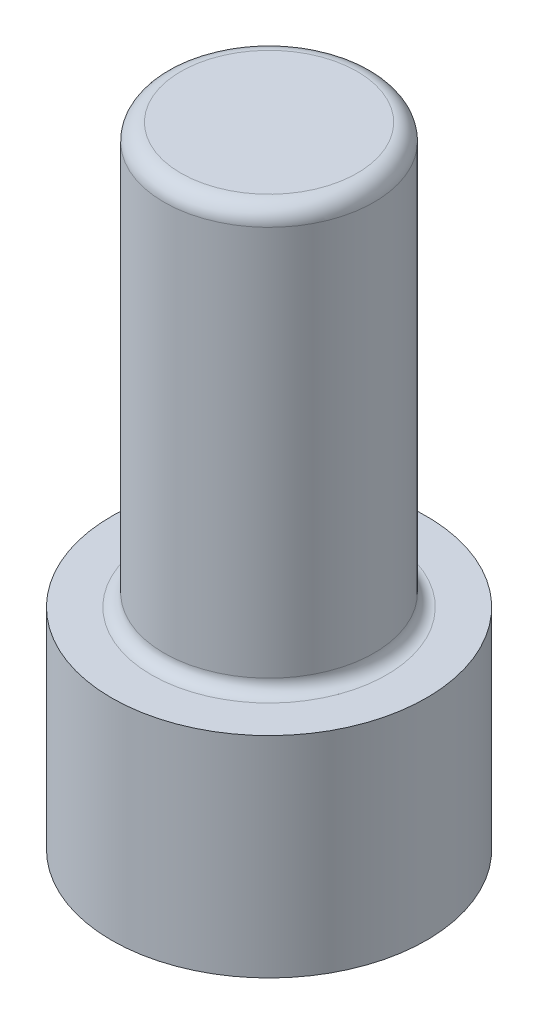
ISO-10303-21;
HEADER;
FILE_DESCRIPTION(('STEP AP214'),'2;1');
FILE_NAME('part.step','',(''),(''),'','','');
FILE_SCHEMA(('AUTOMOTIVE_DESIGN { 1 0 10303 214 1 1 1 1 }'));
ENDSEC;
DATA;
#1=APPLICATION_CONTEXT('core data for automotive mechanical design processes');
#2=APPLICATION_PROTOCOL_DEFINITION('international standard','automotive_design',2000,#1);
#3=PRODUCT_CONTEXT('',#1,'mechanical');
#4=PRODUCT('Part','Part','',(#3));
#5=PRODUCT_RELATED_PRODUCT_CATEGORY('part','',(#4));
#6=PRODUCT_DEFINITION_FORMATION('','',#4);
#7=PRODUCT_DEFINITION_CONTEXT('part definition',#1,'design');
#8=PRODUCT_DEFINITION('design','',#6,#7);
#9=PRODUCT_DEFINITION_SHAPE('','',#8);
#10=(LENGTH_UNIT() NAMED_UNIT(*) SI_UNIT(.MILLI.,.METRE.));
#11=(NAMED_UNIT(*) PLANE_ANGLE_UNIT() SI_UNIT($,.RADIAN.));
#12=(NAMED_UNIT(*) SI_UNIT($,.STERADIAN.) SOLID_ANGLE_UNIT());
#13=UNCERTAINTY_MEASURE_WITH_UNIT(LENGTH_MEASURE(1.E-05),#10,'distance_accuracy_value','');
#14=(GEOMETRIC_REPRESENTATION_CONTEXT(3) GLOBAL_UNCERTAINTY_ASSIGNED_CONTEXT((#13)) GLOBAL_UNIT_ASSIGNED_CONTEXT((#10,
#11,#12)) REPRESENTATION_CONTEXT('',''));
#15=CARTESIAN_POINT('',(0.,0.,0.));
#16=DIRECTION('',(0.,0.,1.));
#17=DIRECTION('',(1.,0.,0.));
#18=AXIS2_PLACEMENT_3D('',#15,#16,#17);
#19=CARTESIAN_POINT('',(0.,250.,0.));
#20=DIRECTION('',(0.,-1.,0.));
#21=DIRECTION('',(0.,0.,-1.));
#22=AXIS2_PLACEMENT_3D('',#19,#20,#21);
#23=CYLINDRICAL_SURFACE('',#22,187.5);
#24=CARTESIAN_POINT('',(0.,250.,0.));
#25=DIRECTION('',(0.,1.,0.));
#26=DIRECTION('',(0.,0.,1.));
#27=AXIS2_PLACEMENT_3D('',#24,#25,#26);
#28=CIRCLE('',#27,187.5);
#29=CARTESIAN_POINT('',(0.,250.,187.5));
#30=VERTEX_POINT('',#29);
#31=EDGE_CURVE('E141',#30,#30,#28,.T.);
#32=ORIENTED_EDGE('',*,*,#31,.F.);
#33=EDGE_LOOP('',(#32));
#34=FACE_BOUND('',#33,.T.);
#35=CARTESIAN_POINT('',(0.,0.,0.));
#36=DIRECTION('',(0.,1.,0.));
#37=DIRECTION('',(0.,0.,1.));
#38=AXIS2_PLACEMENT_3D('',#35,#36,#37);
#39=CIRCLE('',#38,187.5);
#40=CARTESIAN_POINT('',(0.,0.,187.5));
#41=VERTEX_POINT('',#40);
#42=EDGE_CURVE('E135',#41,#41,#39,.T.);
#43=ORIENTED_EDGE('',*,*,#42,.T.);
#44=EDGE_LOOP('',(#43));
#45=FACE_BOUND('',#44,.T.);
#46=ADVANCED_FACE('F33',(#34,#45),#23,.T.);
#47=CARTESIAN_POINT('',(0.,250.,0.));
#48=DIRECTION('',(0.,1.,0.));
#49=DIRECTION('',(0.,0.,1.));
#50=AXIS2_PLACEMENT_3D('',#47,#48,#49);
#51=PLANE('',#50);
#52=CARTESIAN_POINT('',(0.,250.,0.));
#53=DIRECTION('',(0.,1.,0.));
#54=DIRECTION('',(0.,0.,1.));
#55=AXIS2_PLACEMENT_3D('',#52,#53,#54);
#56=CIRCLE('',#55,140.);
#57=CARTESIAN_POINT('',(0.,250.,140.));
#58=VERTEX_POINT('',#57);
#59=EDGE_CURVE('E149',#58,#58,#56,.F.);
#60=ORIENTED_EDGE('',*,*,#59,.T.);
#61=EDGE_LOOP('',(#60));
#62=FACE_BOUND('',#61,.T.);
#63=ORIENTED_EDGE('',*,*,#31,.T.);
#64=EDGE_LOOP('',(#63));
#65=FACE_BOUND('',#64,.T.);
#66=ADVANCED_FACE('F169',(#62,#65),#51,.T.);
#67=CARTESIAN_POINT('',(0.,0.,0.));
#68=DIRECTION('',(0.,1.,0.));
#69=DIRECTION('',(0.,0.,1.));
#70=AXIS2_PLACEMENT_3D('',#67,#68,#69);
#71=PLANE('',#70);
#72=DIRECTION('',(0.207609867923908,0.,-0.978211706503565));
#73=VECTOR('',#72,1.);
#74=CARTESIAN_POINT('',(-97.2142447029592,0.,31.6199889550411));
#75=LINE('',#74,#73);
#76=CARTESIAN_POINT('',(-97.2142447029592,0.,31.6199889550411));
#77=VERTEX_POINT('',#76);
#78=CARTESIAN_POINT('',(-75.9908360539285,0.,-68.380011044959));
#79=VERTEX_POINT('',#78);
#80=EDGE_CURVE('E122',#77,#79,#75,.T.);
#81=ORIENTED_EDGE('',*,*,#80,.F.);
#82=DIRECTION('',(-0.743351254149461,0.,-0.66890127295022));
#83=VECTOR('',#82,1.);
#84=CARTESIAN_POINT('',(-21.2234086490307,0.,100.));
#85=LINE('',#84,#83);
#86=CARTESIAN_POINT('',(-21.2234086490307,0.,100.));
#87=VERTEX_POINT('',#86);
#88=EDGE_CURVE('E48',#87,#77,#85,.T.);
#89=ORIENTED_EDGE('',*,*,#88,.F.);
#90=DIRECTION('',(-0.950961122073369,0.,0.309310433553346));
#91=VECTOR('',#90,1.);
#92=CARTESIAN_POINT('',(75.9908360539285,0.,68.380011044959));
#93=LINE('',#92,#91);
#94=CARTESIAN_POINT('',(75.9908360539285,0.,68.380011044959));
#95=VERTEX_POINT('',#94);
#96=EDGE_CURVE('E131',#95,#87,#93,.T.);
#97=ORIENTED_EDGE('',*,*,#96,.F.);
#98=DIRECTION('',(-0.207609867923908,0.,0.978211706503565));
#99=VECTOR('',#98,1.);
#100=CARTESIAN_POINT('',(97.2142447029592,0.,-31.6199889550411));
#101=LINE('',#100,#99);
#102=CARTESIAN_POINT('',(97.2142447029592,0.,-31.6199889550411));
#103=VERTEX_POINT('',#102);
#104=EDGE_CURVE('E129',#103,#95,#101,.T.);
#105=ORIENTED_EDGE('',*,*,#104,.F.);
#106=DIRECTION('',(0.743351254149461,0.,0.668901272950219));
#107=VECTOR('',#106,1.);
#108=CARTESIAN_POINT('',(21.2234086490307,0.,-100.));
#109=LINE('',#108,#107);
#110=CARTESIAN_POINT('',(21.2234086490307,0.,-100.));
#111=VERTEX_POINT('',#110);
#112=EDGE_CURVE('E96',#111,#103,#109,.T.);
#113=ORIENTED_EDGE('',*,*,#112,.F.);
#114=DIRECTION('',(0.950961122073369,0.,-0.309310433553346));
#115=VECTOR('',#114,1.);
#116=CARTESIAN_POINT('',(-75.9908360539285,0.,-68.380011044959));
#117=LINE('',#116,#115);
#118=EDGE_CURVE('E125',#79,#111,#117,.T.);
#119=ORIENTED_EDGE('',*,*,#118,.F.);
#120=EDGE_LOOP('',(#81,#89,#97,#105,#113,#119));
#121=FACE_BOUND('',#120,.T.);
#122=ORIENTED_EDGE('',*,*,#42,.F.);
#123=EDGE_LOOP('',(#122));
#124=FACE_BOUND('',#123,.T.);
#125=ADVANCED_FACE('F175',(#121,#124),#71,.F.);
#126=CARTESIAN_POINT('',(0.,750.,0.));
#127=DIRECTION('',(0.,-1.,0.));
#128=DIRECTION('',(0.,0.,-1.));
#129=AXIS2_PLACEMENT_3D('',#126,#127,#128);
#130=CYLINDRICAL_SURFACE('',#129,125.);
#131=CARTESIAN_POINT('',(0.,730.,0.));
#132=DIRECTION('',(0.,1.,0.));
#133=DIRECTION('',(0.,0.,1.));
#134=AXIS2_PLACEMENT_3D('',#131,#132,#133);
#135=CIRCLE('',#134,125.);
#136=CARTESIAN_POINT('',(0.,730.,125.));
#137=VERTEX_POINT('',#136);
#138=EDGE_CURVE('E11',#137,#137,#135,.F.);
#139=ORIENTED_EDGE('',*,*,#138,.T.);
#140=EDGE_LOOP('',(#139));
#141=FACE_BOUND('',#140,.T.);
#142=CARTESIAN_POINT('',(0.,265.,0.));
#143=DIRECTION('',(0.,1.,0.));
#144=DIRECTION('',(0.,0.,1.));
#145=AXIS2_PLACEMENT_3D('',#142,#143,#144);
#146=CIRCLE('',#145,125.);
#147=CARTESIAN_POINT('',(0.,265.,125.));
#148=VERTEX_POINT('',#147);
#149=EDGE_CURVE('E144',#148,#148,#146,.T.);
#150=ORIENTED_EDGE('',*,*,#149,.T.);
#151=EDGE_LOOP('',(#150));
#152=FACE_BOUND('',#151,.T.);
#153=ADVANCED_FACE('F182',(#141,#152),#130,.T.);
#154=CARTESIAN_POINT('',(0.,750.,0.));
#155=DIRECTION('',(0.,1.,0.));
#156=DIRECTION('',(0.,0.,1.));
#157=AXIS2_PLACEMENT_3D('',#154,#155,#156);
#158=PLANE('',#157);
#159=CARTESIAN_POINT('',(0.,750.,0.));
#160=DIRECTION('',(0.,1.,0.));
#161=DIRECTION('',(0.,0.,1.));
#162=AXIS2_PLACEMENT_3D('',#159,#160,#161);
#163=CIRCLE('',#162,105.);
#164=CARTESIAN_POINT('',(0.,750.,105.));
#165=VERTEX_POINT('',#164);
#166=EDGE_CURVE('E41',#165,#165,#163,.T.);
#167=ORIENTED_EDGE('',*,*,#166,.T.);
#168=EDGE_LOOP('',(#167));
#169=FACE_BOUND('',#168,.T.);
#170=ADVANCED_FACE('F154',(#169),#158,.T.);
#171=CARTESIAN_POINT('',(0.,265.,0.));
#172=DIRECTION('',(0.,1.,0.));
#173=DIRECTION('',(0.,0.,1.));
#174=AXIS2_PLACEMENT_3D('',#171,#172,#173);
#175=TOROIDAL_SURFACE('',#174,140.,15.);
#176=ORIENTED_EDGE('',*,*,#59,.F.);
#177=EDGE_LOOP('',(#176));
#178=FACE_BOUND('',#177,.T.);
#179=ORIENTED_EDGE('',*,*,#149,.F.);
#180=EDGE_LOOP('',(#179));
#181=FACE_BOUND('',#180,.T.);
#182=ADVANCED_FACE('F158',(#178,#181),#175,.F.);
#183=CARTESIAN_POINT('',(0.,730.,0.));
#184=DIRECTION('',(0.,1.,0.));
#185=DIRECTION('',(0.,0.,1.));
#186=AXIS2_PLACEMENT_3D('',#183,#184,#185);
#187=TOROIDAL_SURFACE('',#186,105.,20.);
#188=ORIENTED_EDGE('',*,*,#138,.F.);
#189=EDGE_LOOP('',(#188));
#190=FACE_BOUND('',#189,.T.);
#191=ORIENTED_EDGE('',*,*,#166,.F.);
#192=EDGE_LOOP('',(#191));
#193=FACE_BOUND('',#192,.T.);
#194=ADVANCED_FACE('F35',(#190,#193),#187,.T.);
#195=CARTESIAN_POINT('',(-21.2234086490307,150.,100.));
#196=DIRECTION('',(-0.668901272950219,0.,0.743351254149461));
#197=DIRECTION('',(0.743351254149461,0.,0.668901272950219));
#198=AXIS2_PLACEMENT_3D('',#195,#196,#197);
#199=PLANE('',#198);
#200=ORIENTED_EDGE('',*,*,#88,.T.);
#201=DIRECTION('',(0.,-1.,0.));
#202=VECTOR('',#201,1.);
#203=CARTESIAN_POINT('',(-97.2142447029592,150.,31.6199889550411));
#204=LINE('',#203,#202);
#205=CARTESIAN_POINT('',(-97.2142447029592,150.,31.6199889550411));
#206=VERTEX_POINT('',#205);
#207=EDGE_CURVE('E78',#206,#77,#204,.T.);
#208=ORIENTED_EDGE('',*,*,#207,.F.);
#209=DIRECTION('',(-0.743351254149461,0.,-0.66890127295022));
#210=VECTOR('',#209,1.);
#211=CARTESIAN_POINT('',(-21.2234086490307,150.,100.));
#212=LINE('',#211,#210);
#213=CARTESIAN_POINT('',(-21.2234086490307,150.,100.));
#214=VERTEX_POINT('',#213);
#215=EDGE_CURVE('E133',#214,#206,#212,.T.);
#216=ORIENTED_EDGE('',*,*,#215,.F.);
#217=DIRECTION('',(0.,-1.,0.));
#218=VECTOR('',#217,1.);
#219=CARTESIAN_POINT('',(-21.2234086490307,150.,100.));
#220=LINE('',#219,#218);
#221=EDGE_CURVE('E56',#214,#87,#220,.T.);
#222=ORIENTED_EDGE('',*,*,#221,.T.);
#223=EDGE_LOOP('',(#200,#208,#216,#222));
#224=FACE_BOUND('',#223,.T.);
#225=ADVANCED_FACE('F157',(#224),#199,.F.);
#226=CARTESIAN_POINT('',(75.9908360539285,150.,68.380011044959));
#227=DIRECTION('',(0.309310433553346,0.,0.950961122073369));
#228=DIRECTION('',(0.950961122073369,0.,-0.309310433553346));
#229=AXIS2_PLACEMENT_3D('',#226,#227,#228);
#230=PLANE('',#229);
#231=ORIENTED_EDGE('',*,*,#96,.T.);
#232=ORIENTED_EDGE('',*,*,#221,.F.);
#233=DIRECTION('',(-0.950961122073369,0.,0.309310433553346));
#234=VECTOR('',#233,1.);
#235=CARTESIAN_POINT('',(75.9908360539285,150.,68.380011044959));
#236=LINE('',#235,#234);
#237=CARTESIAN_POINT('',(75.9908360539285,150.,68.380011044959));
#238=VERTEX_POINT('',#237);
#239=EDGE_CURVE('E108',#238,#214,#236,.T.);
#240=ORIENTED_EDGE('',*,*,#239,.F.);
#241=DIRECTION('',(0.,-1.,0.));
#242=VECTOR('',#241,1.);
#243=CARTESIAN_POINT('',(75.9908360539285,150.,68.380011044959));
#244=LINE('',#243,#242);
#245=EDGE_CURVE('E100',#238,#95,#244,.T.);
#246=ORIENTED_EDGE('',*,*,#245,.T.);
#247=EDGE_LOOP('',(#231,#232,#240,#246));
#248=FACE_BOUND('',#247,.T.);
#249=ADVANCED_FACE('F164',(#248),#230,.F.);
#250=CARTESIAN_POINT('',(97.2142447029592,150.,-31.6199889550411));
#251=DIRECTION('',(0.978211706503565,0.,0.207609867923908));
#252=DIRECTION('',(0.207609867923908,0.,-0.978211706503565));
#253=AXIS2_PLACEMENT_3D('',#250,#251,#252);
#254=PLANE('',#253);
#255=ORIENTED_EDGE('',*,*,#104,.T.);
#256=ORIENTED_EDGE('',*,*,#245,.F.);
#257=DIRECTION('',(-0.207609867923908,0.,0.978211706503565));
#258=VECTOR('',#257,1.);
#259=CARTESIAN_POINT('',(97.2142447029592,150.,-31.6199889550411));
#260=LINE('',#259,#258);
#261=CARTESIAN_POINT('',(97.2142447029592,150.,-31.6199889550411));
#262=VERTEX_POINT('',#261);
#263=EDGE_CURVE('E104',#262,#238,#260,.T.);
#264=ORIENTED_EDGE('',*,*,#263,.F.);
#265=DIRECTION('',(0.,-1.,0.));
#266=VECTOR('',#265,1.);
#267=CARTESIAN_POINT('',(97.2142447029592,150.,-31.6199889550411));
#268=LINE('',#267,#266);
#269=EDGE_CURVE('E89',#262,#103,#268,.T.);
#270=ORIENTED_EDGE('',*,*,#269,.T.);
#271=EDGE_LOOP('',(#255,#256,#264,#270));
#272=FACE_BOUND('',#271,.T.);
#273=ADVANCED_FACE('F105',(#272),#254,.F.);
#274=CARTESIAN_POINT('',(21.2234086490307,150.,-100.));
#275=DIRECTION('',(0.668901272950219,0.,-0.743351254149461));
#276=DIRECTION('',(-0.743351254149461,0.,-0.668901272950219));
#277=AXIS2_PLACEMENT_3D('',#274,#275,#276);
#278=PLANE('',#277);
#279=ORIENTED_EDGE('',*,*,#112,.T.);
#280=ORIENTED_EDGE('',*,*,#269,.F.);
#281=DIRECTION('',(0.743351254149461,0.,0.668901272950219));
#282=VECTOR('',#281,1.);
#283=CARTESIAN_POINT('',(21.2234086490307,150.,-100.));
#284=LINE('',#283,#282);
#285=CARTESIAN_POINT('',(21.2234086490307,150.,-100.));
#286=VERTEX_POINT('',#285);
#287=EDGE_CURVE('E93',#286,#262,#284,.T.);
#288=ORIENTED_EDGE('',*,*,#287,.F.);
#289=DIRECTION('',(0.,-1.,0.));
#290=VECTOR('',#289,1.);
#291=CARTESIAN_POINT('',(21.2234086490307,150.,-100.));
#292=LINE('',#291,#290);
#293=EDGE_CURVE('E101',#286,#111,#292,.T.);
#294=ORIENTED_EDGE('',*,*,#293,.T.);
#295=EDGE_LOOP('',(#279,#280,#288,#294));
#296=FACE_BOUND('',#295,.T.);
#297=ADVANCED_FACE('F91',(#296),#278,.F.);
#298=CARTESIAN_POINT('',(-75.9908360539285,150.,-68.380011044959));
#299=DIRECTION('',(-0.309310433553346,0.,-0.950961122073369));
#300=DIRECTION('',(-0.950961122073369,0.,0.309310433553346));
#301=AXIS2_PLACEMENT_3D('',#298,#299,#300);
#302=PLANE('',#301);
#303=ORIENTED_EDGE('',*,*,#118,.T.);
#304=ORIENTED_EDGE('',*,*,#293,.F.);
#305=DIRECTION('',(0.950961122073369,0.,-0.309310433553346));
#306=VECTOR('',#305,1.);
#307=CARTESIAN_POINT('',(-75.9908360539285,150.,-68.380011044959));
#308=LINE('',#307,#306);
#309=CARTESIAN_POINT('',(-75.9908360539285,150.,-68.380011044959));
#310=VERTEX_POINT('',#309);
#311=EDGE_CURVE('E114',#310,#286,#308,.T.);
#312=ORIENTED_EDGE('',*,*,#311,.F.);
#313=DIRECTION('',(0.,-1.,0.));
#314=VECTOR('',#313,1.);
#315=CARTESIAN_POINT('',(-75.9908360539285,150.,-68.380011044959));
#316=LINE('',#315,#314);
#317=EDGE_CURVE('E138',#310,#79,#316,.T.);
#318=ORIENTED_EDGE('',*,*,#317,.T.);
#319=EDGE_LOOP('',(#303,#304,#312,#318));
#320=FACE_BOUND('',#319,.T.);
#321=ADVANCED_FACE('F193',(#320),#302,.F.);
#322=CARTESIAN_POINT('',(-97.2142447029592,150.,31.6199889550411));
#323=DIRECTION('',(-0.978211706503565,0.,-0.207609867923908));
#324=DIRECTION('',(-0.207609867923908,0.,0.978211706503565));
#325=AXIS2_PLACEMENT_3D('',#322,#323,#324);
#326=PLANE('',#325);
#327=ORIENTED_EDGE('',*,*,#80,.T.);
#328=ORIENTED_EDGE('',*,*,#317,.F.);
#329=DIRECTION('',(0.207609867923908,0.,-0.978211706503565));
#330=VECTOR('',#329,1.);
#331=CARTESIAN_POINT('',(-97.2142447029592,150.,31.6199889550411));
#332=LINE('',#331,#330);
#333=EDGE_CURVE('E116',#206,#310,#332,.T.);
#334=ORIENTED_EDGE('',*,*,#333,.F.);
#335=ORIENTED_EDGE('',*,*,#207,.T.);
#336=EDGE_LOOP('',(#327,#328,#334,#335));
#337=FACE_BOUND('',#336,.T.);
#338=ADVANCED_FACE('F190',(#337),#326,.F.);
#339=CARTESIAN_POINT('',(0.,150.,0.));
#340=DIRECTION('',(0.,-1.,0.));
#341=DIRECTION('',(0.,0.,-1.));
#342=AXIS2_PLACEMENT_3D('',#339,#340,#341);
#343=PLANE('',#342);
#344=ORIENTED_EDGE('',*,*,#215,.T.);
#345=ORIENTED_EDGE('',*,*,#333,.T.);
#346=ORIENTED_EDGE('',*,*,#311,.T.);
#347=ORIENTED_EDGE('',*,*,#287,.T.);
#348=ORIENTED_EDGE('',*,*,#263,.T.);
#349=ORIENTED_EDGE('',*,*,#239,.T.);
#350=EDGE_LOOP('',(#344,#345,#346,#347,#348,#349));
#351=FACE_BOUND('',#350,.T.);
#352=ADVANCED_FACE('F111',(#351),#343,.T.);
#353=CLOSED_SHELL('',(#46,#66,#125,#153,#170,#182,#194,#225,#249,#273,#297,#321,#338,#352));
#354=MANIFOLD_SOLID_BREP('B2',#353);
#355=ADVANCED_BREP_SHAPE_REPRESENTATION('',(#18,#354),#14);
#356=SHAPE_DEFINITION_REPRESENTATION(#9,#355);
ENDSEC;
END-ISO-10303-21;
